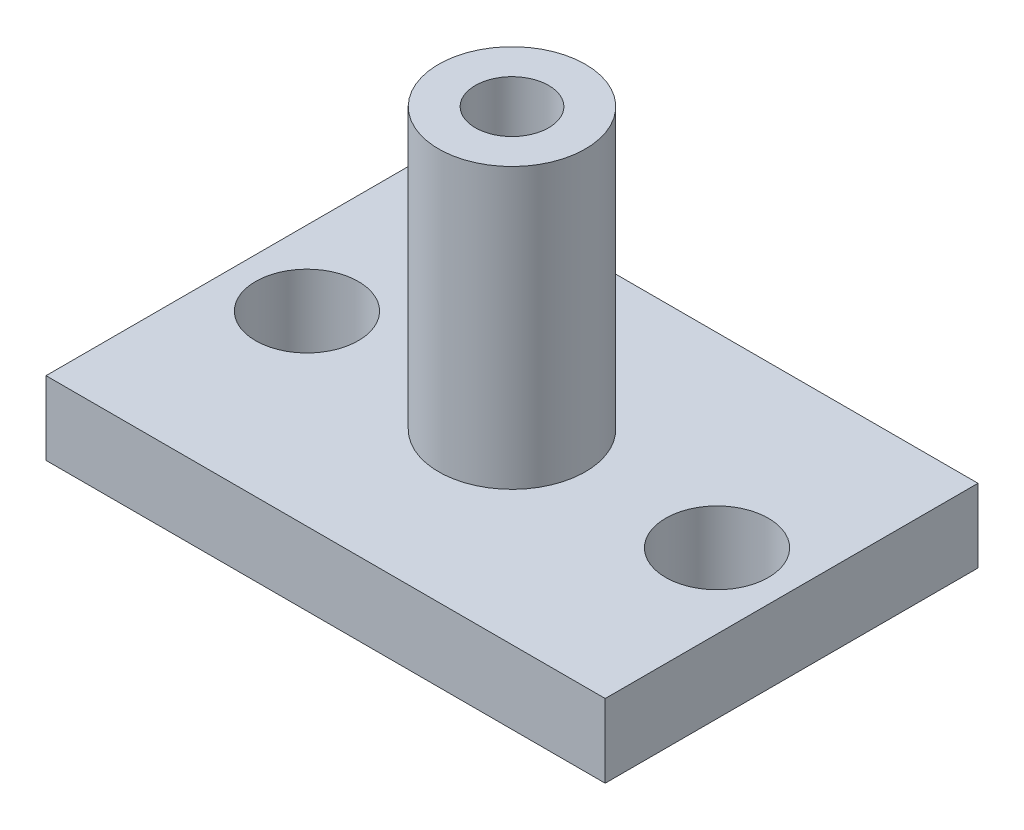
ISO-10303-21;
HEADER;
FILE_DESCRIPTION(('STEP AP214'),'2;1');
FILE_NAME('part.step','',(''),(''),'','','');
FILE_SCHEMA(('AUTOMOTIVE_DESIGN { 1 0 10303 214 1 1 1 1 }'));
ENDSEC;
DATA;
#1=APPLICATION_CONTEXT('core data for automotive mechanical design processes');
#2=APPLICATION_PROTOCOL_DEFINITION('international standard','automotive_design',2000,#1);
#3=PRODUCT_CONTEXT('',#1,'mechanical');
#4=PRODUCT('Part','Part','',(#3));
#5=PRODUCT_RELATED_PRODUCT_CATEGORY('part','',(#4));
#6=PRODUCT_DEFINITION_FORMATION('','',#4);
#7=PRODUCT_DEFINITION_CONTEXT('part definition',#1,'design');
#8=PRODUCT_DEFINITION('design','',#6,#7);
#9=PRODUCT_DEFINITION_SHAPE('','',#8);
#10=(LENGTH_UNIT() NAMED_UNIT(*) SI_UNIT(.MILLI.,.METRE.));
#11=(NAMED_UNIT(*) PLANE_ANGLE_UNIT() SI_UNIT($,.RADIAN.));
#12=(NAMED_UNIT(*) SI_UNIT($,.STERADIAN.) SOLID_ANGLE_UNIT());
#13=UNCERTAINTY_MEASURE_WITH_UNIT(LENGTH_MEASURE(1.E-05),#10,'distance_accuracy_value','');
#14=(GEOMETRIC_REPRESENTATION_CONTEXT(3) GLOBAL_UNCERTAINTY_ASSIGNED_CONTEXT((#13)) GLOBAL_UNIT_ASSIGNED_CONTEXT((#10,
#11,#12)) REPRESENTATION_CONTEXT('',''));
#15=CARTESIAN_POINT('',(0.,0.,0.));
#16=DIRECTION('',(0.,0.,1.));
#17=DIRECTION('',(1.,0.,0.));
#18=AXIS2_PLACEMENT_3D('',#15,#16,#17);
#19=CARTESIAN_POINT('',(0.,5.,0.));
#20=DIRECTION('',(0.,1.,0.));
#21=DIRECTION('',(0.,0.,1.));
#22=AXIS2_PLACEMENT_3D('',#19,#20,#21);
#23=PLANE('',#22);
#24=CARTESIAN_POINT('',(-20.7617391304348,5.,0.));
#25=DIRECTION('',(0.,1.,0.));
#26=DIRECTION('',(0.,0.,1.));
#27=AXIS2_PLACEMENT_3D('',#24,#25,#26);
#28=CIRCLE('',#27,3.5);
#29=CARTESIAN_POINT('',(-20.7617391304348,5.,3.5));
#30=VERTEX_POINT('',#29);
#31=EDGE_CURVE('E166',#30,#30,#28,.T.);
#32=ORIENTED_EDGE('',*,*,#31,.F.);
#33=EDGE_LOOP('',(#32));
#34=FACE_BOUND('',#33,.T.);
#35=CARTESIAN_POINT('',(7.17826086956524,5.,0.));
#36=DIRECTION('',(0.,1.,0.));
#37=DIRECTION('',(0.,0.,1.));
#38=AXIS2_PLACEMENT_3D('',#35,#36,#37);
#39=CIRCLE('',#38,3.5);
#40=CARTESIAN_POINT('',(7.17826086956524,5.,3.5));
#41=VERTEX_POINT('',#40);
#42=EDGE_CURVE('E168',#41,#41,#39,.T.);
#43=ORIENTED_EDGE('',*,*,#42,.F.);
#44=EDGE_LOOP('',(#43));
#45=FACE_BOUND('',#44,.T.);
#46=DIRECTION('',(0.,0.,1.));
#47=VECTOR('',#46,1.);
#48=CARTESIAN_POINT('',(-25.8417391304348,5.,-12.7));
#49=LINE('',#48,#47);
#50=CARTESIAN_POINT('',(-25.8417391304348,5.,-12.7));
#51=VERTEX_POINT('',#50);
#52=CARTESIAN_POINT('',(-25.8417391304348,5.,12.7));
#53=VERTEX_POINT('',#52);
#54=EDGE_CURVE('E86',#51,#53,#49,.T.);
#55=ORIENTED_EDGE('',*,*,#54,.T.);
#56=DIRECTION('',(1.,0.,0.));
#57=VECTOR('',#56,1.);
#58=CARTESIAN_POINT('',(-25.8417391304348,5.,12.7));
#59=LINE('',#58,#57);
#60=CARTESIAN_POINT('',(12.2582608695652,5.,12.7));
#61=VERTEX_POINT('',#60);
#62=EDGE_CURVE('E81',#53,#61,#59,.T.);
#63=ORIENTED_EDGE('',*,*,#62,.T.);
#64=DIRECTION('',(0.,0.,-1.));
#65=VECTOR('',#64,1.);
#66=CARTESIAN_POINT('',(12.2582608695652,5.,-12.7));
#67=LINE('',#66,#65);
#68=CARTESIAN_POINT('',(12.2582608695652,5.,-12.7));
#69=VERTEX_POINT('',#68);
#70=EDGE_CURVE('E84',#61,#69,#67,.T.);
#71=ORIENTED_EDGE('',*,*,#70,.T.);
#72=DIRECTION('',(-1.,0.,0.));
#73=VECTOR('',#72,1.);
#74=CARTESIAN_POINT('',(-25.8417391304348,5.,-12.7));
#75=LINE('',#74,#73);
#76=EDGE_CURVE('E50',#69,#51,#75,.T.);
#77=ORIENTED_EDGE('',*,*,#76,.T.);
#78=EDGE_LOOP('',(#55,#63,#71,#77));
#79=FACE_BOUND('',#78,.T.);
#80=CARTESIAN_POINT('',(-6.79173913043476,5.,0.));
#81=DIRECTION('',(0.,1.,0.));
#82=DIRECTION('',(0.,0.,1.));
#83=AXIS2_PLACEMENT_3D('',#80,#81,#82);
#84=CIRCLE('',#83,5.);
#85=CARTESIAN_POINT('',(-6.79173913043476,5.,-5.00000000000001));
#86=VERTEX_POINT('',#85);
#87=EDGE_CURVE('E178',#86,#86,#84,.T.);
#88=ORIENTED_EDGE('',*,*,#87,.F.);
#89=EDGE_LOOP('',(#88));
#90=FACE_BOUND('',#89,.T.);
#91=ADVANCED_FACE('F33',(#34,#45,#79,#90),#23,.T.);
#92=CARTESIAN_POINT('',(-25.8417391304348,5.,-12.7));
#93=DIRECTION('',(1.,0.,0.));
#94=DIRECTION('',(0.,0.,-1.));
#95=AXIS2_PLACEMENT_3D('',#92,#93,#94);
#96=PLANE('',#95);
#97=DIRECTION('',(0.,0.,1.));
#98=VECTOR('',#97,1.);
#99=CARTESIAN_POINT('',(-25.8417391304348,0.,-12.7));
#100=LINE('',#99,#98);
#101=CARTESIAN_POINT('',(-25.8417391304348,0.,-12.7));
#102=VERTEX_POINT('',#101);
#103=CARTESIAN_POINT('',(-25.8417391304348,0.,12.7));
#104=VERTEX_POINT('',#103);
#105=EDGE_CURVE('E100',#102,#104,#100,.T.);
#106=ORIENTED_EDGE('',*,*,#105,.T.);
#107=DIRECTION('',(0.,-1.,0.));
#108=VECTOR('',#107,1.);
#109=CARTESIAN_POINT('',(-25.8417391304348,5.,12.7));
#110=LINE('',#109,#108);
#111=EDGE_CURVE('E42',#53,#104,#110,.T.);
#112=ORIENTED_EDGE('',*,*,#111,.F.);
#113=ORIENTED_EDGE('',*,*,#54,.F.);
#114=DIRECTION('',(0.,-1.,0.));
#115=VECTOR('',#114,1.);
#116=CARTESIAN_POINT('',(-25.8417391304348,5.,-12.7));
#117=LINE('',#116,#115);
#118=EDGE_CURVE('E96',#51,#102,#117,.T.);
#119=ORIENTED_EDGE('',*,*,#118,.T.);
#120=EDGE_LOOP('',(#106,#112,#113,#119));
#121=FACE_BOUND('',#120,.T.);
#122=ADVANCED_FACE('F35',(#121),#96,.F.);
#123=CARTESIAN_POINT('',(-25.8417391304348,5.,12.7));
#124=DIRECTION('',(0.,0.,-1.));
#125=DIRECTION('',(-1.,0.,0.));
#126=AXIS2_PLACEMENT_3D('',#123,#124,#125);
#127=PLANE('',#126);
#128=DIRECTION('',(1.,0.,0.));
#129=VECTOR('',#128,1.);
#130=CARTESIAN_POINT('',(-25.8417391304348,0.,12.7));
#131=LINE('',#130,#129);
#132=CARTESIAN_POINT('',(12.2582608695652,0.,12.7));
#133=VERTEX_POINT('',#132);
#134=EDGE_CURVE('E91',#104,#133,#131,.T.);
#135=ORIENTED_EDGE('',*,*,#134,.T.);
#136=DIRECTION('',(0.,-1.,0.));
#137=VECTOR('',#136,1.);
#138=CARTESIAN_POINT('',(12.2582608695652,5.,12.7));
#139=LINE('',#138,#137);
#140=EDGE_CURVE('E89',#61,#133,#139,.T.);
#141=ORIENTED_EDGE('',*,*,#140,.F.);
#142=ORIENTED_EDGE('',*,*,#62,.F.);
#143=ORIENTED_EDGE('',*,*,#111,.T.);
#144=EDGE_LOOP('',(#135,#141,#142,#143));
#145=FACE_BOUND('',#144,.T.);
#146=ADVANCED_FACE('F90',(#145),#127,.F.);
#147=CARTESIAN_POINT('',(12.2582608695652,5.,-12.7));
#148=DIRECTION('',(-1.,0.,0.));
#149=DIRECTION('',(0.,0.,1.));
#150=AXIS2_PLACEMENT_3D('',#147,#148,#149);
#151=PLANE('',#150);
#152=DIRECTION('',(0.,0.,-1.));
#153=VECTOR('',#152,1.);
#154=CARTESIAN_POINT('',(12.2582608695652,0.,-12.7));
#155=LINE('',#154,#153);
#156=CARTESIAN_POINT('',(12.2582608695652,0.,-12.7));
#157=VERTEX_POINT('',#156);
#158=EDGE_CURVE('E67',#133,#157,#155,.T.);
#159=ORIENTED_EDGE('',*,*,#158,.T.);
#160=DIRECTION('',(0.,-1.,0.));
#161=VECTOR('',#160,1.);
#162=CARTESIAN_POINT('',(12.2582608695652,5.,-12.7));
#163=LINE('',#162,#161);
#164=EDGE_CURVE('E92',#69,#157,#163,.T.);
#165=ORIENTED_EDGE('',*,*,#164,.F.);
#166=ORIENTED_EDGE('',*,*,#70,.F.);
#167=ORIENTED_EDGE('',*,*,#140,.T.);
#168=EDGE_LOOP('',(#159,#165,#166,#167));
#169=FACE_BOUND('',#168,.T.);
#170=ADVANCED_FACE('F94',(#169),#151,.F.);
#171=CARTESIAN_POINT('',(-25.8417391304348,5.,-12.7));
#172=DIRECTION('',(0.,0.,1.));
#173=DIRECTION('',(1.,0.,0.));
#174=AXIS2_PLACEMENT_3D('',#171,#172,#173);
#175=PLANE('',#174);
#176=DIRECTION('',(-1.,0.,0.));
#177=VECTOR('',#176,1.);
#178=CARTESIAN_POINT('',(-25.8417391304348,0.,-12.7));
#179=LINE('',#178,#177);
#180=EDGE_CURVE('E73',#157,#102,#179,.T.);
#181=ORIENTED_EDGE('',*,*,#180,.T.);
#182=ORIENTED_EDGE('',*,*,#118,.F.);
#183=ORIENTED_EDGE('',*,*,#76,.F.);
#184=ORIENTED_EDGE('',*,*,#164,.T.);
#185=EDGE_LOOP('',(#181,#182,#183,#184));
#186=FACE_BOUND('',#185,.T.);
#187=ADVANCED_FACE('F114',(#186),#175,.F.);
#188=CARTESIAN_POINT('',(0.,0.,0.));
#189=DIRECTION('',(0.,1.,0.));
#190=DIRECTION('',(0.,0.,1.));
#191=AXIS2_PLACEMENT_3D('',#188,#189,#190);
#192=PLANE('',#191);
#193=CARTESIAN_POINT('',(-20.7617391304348,0.,0.));
#194=DIRECTION('',(0.,1.,0.));
#195=DIRECTION('',(0.,0.,1.));
#196=AXIS2_PLACEMENT_3D('',#193,#194,#195);
#197=CIRCLE('',#196,3.5);
#198=CARTESIAN_POINT('',(-20.7617391304348,0.,3.5));
#199=VERTEX_POINT('',#198);
#200=EDGE_CURVE('E164',#199,#199,#197,.T.);
#201=ORIENTED_EDGE('',*,*,#200,.T.);
#202=EDGE_LOOP('',(#201));
#203=FACE_BOUND('',#202,.T.);
#204=CARTESIAN_POINT('',(7.17826086956524,0.,0.));
#205=DIRECTION('',(0.,1.,0.));
#206=DIRECTION('',(0.,0.,1.));
#207=AXIS2_PLACEMENT_3D('',#204,#205,#206);
#208=CIRCLE('',#207,3.5);
#209=CARTESIAN_POINT('',(7.17826086956524,0.,3.5));
#210=VERTEX_POINT('',#209);
#211=EDGE_CURVE('E171',#210,#210,#208,.T.);
#212=ORIENTED_EDGE('',*,*,#211,.T.);
#213=EDGE_LOOP('',(#212));
#214=FACE_BOUND('',#213,.T.);
#215=ORIENTED_EDGE('',*,*,#105,.F.);
#216=ORIENTED_EDGE('',*,*,#180,.F.);
#217=ORIENTED_EDGE('',*,*,#158,.F.);
#218=ORIENTED_EDGE('',*,*,#134,.F.);
#219=EDGE_LOOP('',(#215,#216,#217,#218));
#220=FACE_BOUND('',#219,.T.);
#221=ADVANCED_FACE('F111',(#203,#214,#220),#192,.F.);
#222=CARTESIAN_POINT('',(-6.79173913043476,24.05,0.));
#223=DIRECTION('',(0.,1.,0.));
#224=DIRECTION('',(0.,0.,1.));
#225=AXIS2_PLACEMENT_3D('',#222,#223,#224);
#226=PLANE('',#225);
#227=CARTESIAN_POINT('',(-6.79173913043476,24.05,0.));
#228=DIRECTION('',(0.,1.,0.));
#229=DIRECTION('',(0.,0.,1.));
#230=AXIS2_PLACEMENT_3D('',#227,#228,#229);
#231=CIRCLE('',#230,5.);
#232=CARTESIAN_POINT('',(-6.79173913043476,24.05,-5.00000000000001));
#233=VERTEX_POINT('',#232);
#234=EDGE_CURVE('E103',#233,#233,#231,.T.);
#235=ORIENTED_EDGE('',*,*,#234,.T.);
#236=EDGE_LOOP('',(#235));
#237=FACE_BOUND('',#236,.T.);
#238=CARTESIAN_POINT('',(-6.79173913043476,24.05,0.));
#239=DIRECTION('',(0.,1.,0.));
#240=DIRECTION('',(0.,0.,1.));
#241=AXIS2_PLACEMENT_3D('',#238,#239,#240);
#242=CIRCLE('',#241,2.5);
#243=CARTESIAN_POINT('',(-6.79173913043476,24.05,-2.50000000000001));
#244=VERTEX_POINT('',#243);
#245=EDGE_CURVE('E174',#244,#244,#242,.T.);
#246=ORIENTED_EDGE('',*,*,#245,.F.);
#247=EDGE_LOOP('',(#246));
#248=FACE_BOUND('',#247,.T.);
#249=ADVANCED_FACE('F113',(#237,#248),#226,.T.);
#250=CARTESIAN_POINT('',(-6.79173913043476,24.05,0.));
#251=DIRECTION('',(0.,-1.,0.));
#252=DIRECTION('',(0.,0.,-1.));
#253=AXIS2_PLACEMENT_3D('',#250,#251,#252);
#254=CYLINDRICAL_SURFACE('',#253,5.);
#255=CARTESIAN_POINT('',(-6.79173913043476,24.05,-5.00000000000001));
#256=CARTESIAN_POINT('',(-6.79173913043476,23.8515625,-5.00000000000001));
#257=CARTESIAN_POINT('',(-6.79173913043476,23.653125,-5.00000000000001));
#258=CARTESIAN_POINT('',(-6.79173913043476,23.25625,-5.00000000000001));
#259=CARTESIAN_POINT('',(-6.79173913043476,23.0578125,-5.00000000000001));
#260=CARTESIAN_POINT('',(-6.79173913043476,22.6609375,-5.00000000000001));
#261=CARTESIAN_POINT('',(-6.79173913043476,22.4625,-5.00000000000001));
#262=CARTESIAN_POINT('',(-6.79173913043476,22.065625,-5.00000000000001));
#263=CARTESIAN_POINT('',(-6.79173913043476,21.8671875,-5.00000000000001));
#264=CARTESIAN_POINT('',(-6.79173913043476,21.4703125,-5.00000000000001));
#265=CARTESIAN_POINT('',(-6.79173913043476,21.271875,-5.00000000000001));
#266=CARTESIAN_POINT('',(-6.79173913043476,20.875,-5.00000000000001));
#267=CARTESIAN_POINT('',(-6.79173913043476,20.6765625,-5.00000000000001));
#268=CARTESIAN_POINT('',(-6.79173913043476,20.2796875,-5.00000000000001));
#269=CARTESIAN_POINT('',(-6.79173913043476,20.08125,-5.00000000000001));
#270=CARTESIAN_POINT('',(-6.79173913043476,19.684375,-5.00000000000001));
#271=CARTESIAN_POINT('',(-6.79173913043476,19.4859375,-5.00000000000001));
#272=CARTESIAN_POINT('',(-6.79173913043476,19.0890625,-5.00000000000001));
#273=CARTESIAN_POINT('',(-6.79173913043476,18.890625,-5.00000000000001));
#274=CARTESIAN_POINT('',(-6.79173913043476,18.49375,-5.00000000000001));
#275=CARTESIAN_POINT('',(-6.79173913043476,18.2953125,-5.00000000000001));
#276=CARTESIAN_POINT('',(-6.79173913043476,17.8984375,-5.00000000000001));
#277=CARTESIAN_POINT('',(-6.79173913043476,17.7,-5.00000000000001));
#278=CARTESIAN_POINT('',(-6.79173913043476,17.303125,-5.00000000000001));
#279=CARTESIAN_POINT('',(-6.79173913043476,17.1046875,-5.00000000000001));
#280=CARTESIAN_POINT('',(-6.79173913043476,16.7078125,-5.00000000000001));
#281=CARTESIAN_POINT('',(-6.79173913043476,16.509375,-5.00000000000001));
#282=CARTESIAN_POINT('',(-6.79173913043476,16.1125,-5.00000000000001));
#283=CARTESIAN_POINT('',(-6.79173913043476,15.9140625,-5.00000000000001));
#284=CARTESIAN_POINT('',(-6.79173913043476,15.5171875,-5.00000000000001));
#285=CARTESIAN_POINT('',(-6.79173913043476,15.31875,-5.00000000000001));
#286=CARTESIAN_POINT('',(-6.79173913043476,14.921875,-5.00000000000001));
#287=CARTESIAN_POINT('',(-6.79173913043476,14.7234375,-5.00000000000001));
#288=CARTESIAN_POINT('',(-6.79173913043476,14.3265625,-5.00000000000001));
#289=CARTESIAN_POINT('',(-6.79173913043476,14.128125,-5.00000000000001));
#290=CARTESIAN_POINT('',(-6.79173913043476,13.73125,-5.00000000000001));
#291=CARTESIAN_POINT('',(-6.79173913043476,13.5328125,-5.00000000000001));
#292=CARTESIAN_POINT('',(-6.79173913043476,13.1359375,-5.00000000000001));
#293=CARTESIAN_POINT('',(-6.79173913043476,12.9375,-5.00000000000001));
#294=CARTESIAN_POINT('',(-6.79173913043476,12.540625,-5.00000000000001));
#295=CARTESIAN_POINT('',(-6.79173913043476,12.3421875,-5.00000000000001));
#296=CARTESIAN_POINT('',(-6.79173913043476,11.9453125,-5.00000000000001));
#297=CARTESIAN_POINT('',(-6.79173913043476,11.746875,-5.00000000000001));
#298=CARTESIAN_POINT('',(-6.79173913043476,11.35,-5.00000000000001));
#299=CARTESIAN_POINT('',(-6.79173913043476,11.1515625,-5.00000000000001));
#300=CARTESIAN_POINT('',(-6.79173913043476,10.7546875,-5.00000000000001));
#301=CARTESIAN_POINT('',(-6.79173913043476,10.55625,-5.00000000000001));
#302=CARTESIAN_POINT('',(-6.79173913043476,10.159375,-5.00000000000001));
#303=CARTESIAN_POINT('',(-6.79173913043476,9.9609375,-5.00000000000001));
#304=CARTESIAN_POINT('',(-6.79173913043476,9.5640625,-5.00000000000001));
#305=CARTESIAN_POINT('',(-6.79173913043476,9.365625,-5.00000000000001));
#306=CARTESIAN_POINT('',(-6.79173913043476,8.96875,-5.00000000000001));
#307=CARTESIAN_POINT('',(-6.79173913043476,8.7703125,-5.00000000000001));
#308=CARTESIAN_POINT('',(-6.79173913043476,8.3734375,-5.00000000000001));
#309=CARTESIAN_POINT('',(-6.79173913043476,8.175,-5.00000000000001));
#310=CARTESIAN_POINT('',(-6.79173913043476,7.778125,-5.00000000000001));
#311=CARTESIAN_POINT('',(-6.79173913043476,7.5796875,-5.00000000000001));
#312=CARTESIAN_POINT('',(-6.79173913043476,7.1828125,-5.00000000000001));
#313=CARTESIAN_POINT('',(-6.79173913043476,6.984375,-5.00000000000001));
#314=CARTESIAN_POINT('',(-6.79173913043476,6.5875,-5.00000000000001));
#315=CARTESIAN_POINT('',(-6.79173913043476,6.3890625,-5.00000000000001));
#316=CARTESIAN_POINT('',(-6.79173913043476,5.9921875,-5.00000000000001));
#317=CARTESIAN_POINT('',(-6.79173913043476,5.79375,-5.00000000000001));
#318=CARTESIAN_POINT('',(-6.79173913043476,5.396875,-5.00000000000001));
#319=CARTESIAN_POINT('',(-6.79173913043476,5.1984375,-5.00000000000001));
#320=CARTESIAN_POINT('',(-6.79173913043476,5.,-5.00000000000001));
#321=B_SPLINE_CURVE_WITH_KNOTS('',3,(#255,#256,#257,#258,#259,#260,#261,#262,#263,#264,#265,
#266,#267,#268,#269,#270,#271,#272,#273,#274,#275,#276,#277,#278,#279,#280,#281,#282,#283,#284,
#285,#286,#287,#288,#289,#290,#291,#292,#293,#294,#295,#296,#297,#298,#299,#300,#301,#302,#303,
#304,#305,#306,#307,#308,#309,#310,#311,#312,#313,#314,#315,#316,#317,#318,#319,#320),
.UNSPECIFIED.,.F.,.F.,(4,2,2,2,2,2,2,2,2,2,2,2,2,2,2,2,2,2,2,2,2,2,2,2,2,2,2,2,2,2,2,2,4),(0.,
0.5953125,1.190625,1.7859375,2.38125,2.9765625,3.571875,4.1671875,4.7625,5.3578125,5.953125,
6.5484375,7.14375,7.7390625,8.334375,8.9296875,9.525,10.1203125,10.715625,11.3109375,11.90625,
12.5015625,13.096875,13.6921875,14.2875,14.8828125,15.478125,16.0734375,16.66875,17.2640625,
17.859375,18.4546875,19.05),.UNSPECIFIED.);
#322=EDGE_CURVE('BSEAM121',#233,#86,#321,.T.);
#323=ORIENTED_EDGE('',*,*,#234,.F.);
#324=ORIENTED_EDGE('',*,*,#87,.T.);
#325=ORIENTED_EDGE('',*,*,#322,.T.);
#326=ORIENTED_EDGE('',*,*,#322,.F.);
#327=EDGE_LOOP('',(#323,#325,#324,#326));
#328=FACE_BOUND('',#327,.T.);
#329=ADVANCED_FACE('F121',(#328),#254,.T.);
#330=CARTESIAN_POINT('',(-6.79173913043476,24.05,0.));
#331=DIRECTION('',(0.,-1.,0.));
#332=DIRECTION('',(0.,0.,-1.));
#333=AXIS2_PLACEMENT_3D('',#330,#331,#332);
#334=CYLINDRICAL_SURFACE('',#333,2.5);
#335=CARTESIAN_POINT('',(-6.79173913043476,5.,0.));
#336=DIRECTION('',(0.,1.,0.));
#337=DIRECTION('',(0.,0.,1.));
#338=AXIS2_PLACEMENT_3D('',#335,#336,#337);
#339=CIRCLE('',#338,2.5);
#340=CARTESIAN_POINT('',(-6.79173913043476,5.,-2.50000000000001));
#341=VERTEX_POINT('',#340);
#342=EDGE_CURVE('E11',#341,#341,#339,.F.);
#343=CARTESIAN_POINT('',(-6.79173913043476,24.05,-2.50000000000001));
#344=CARTESIAN_POINT('',(-6.79173913043476,23.8515625,-2.50000000000001));
#345=CARTESIAN_POINT('',(-6.79173913043476,23.653125,-2.50000000000001));
#346=CARTESIAN_POINT('',(-6.79173913043476,23.25625,-2.50000000000001));
#347=CARTESIAN_POINT('',(-6.79173913043476,23.0578125,-2.50000000000001));
#348=CARTESIAN_POINT('',(-6.79173913043476,22.6609375,-2.50000000000001));
#349=CARTESIAN_POINT('',(-6.79173913043476,22.4625,-2.50000000000001));
#350=CARTESIAN_POINT('',(-6.79173913043476,22.065625,-2.50000000000001));
#351=CARTESIAN_POINT('',(-6.79173913043476,21.8671875,-2.50000000000001));
#352=CARTESIAN_POINT('',(-6.79173913043476,21.4703125,-2.50000000000001));
#353=CARTESIAN_POINT('',(-6.79173913043476,21.271875,-2.50000000000001));
#354=CARTESIAN_POINT('',(-6.79173913043476,20.875,-2.50000000000001));
#355=CARTESIAN_POINT('',(-6.79173913043476,20.6765625,-2.50000000000001));
#356=CARTESIAN_POINT('',(-6.79173913043476,20.2796875,-2.50000000000001));
#357=CARTESIAN_POINT('',(-6.79173913043476,20.08125,-2.50000000000001));
#358=CARTESIAN_POINT('',(-6.79173913043476,19.684375,-2.50000000000001));
#359=CARTESIAN_POINT('',(-6.79173913043476,19.4859375,-2.50000000000001));
#360=CARTESIAN_POINT('',(-6.79173913043476,19.0890625,-2.50000000000001));
#361=CARTESIAN_POINT('',(-6.79173913043476,18.890625,-2.50000000000001));
#362=CARTESIAN_POINT('',(-6.79173913043476,18.49375,-2.50000000000001));
#363=CARTESIAN_POINT('',(-6.79173913043476,18.2953125,-2.50000000000001));
#364=CARTESIAN_POINT('',(-6.79173913043476,17.8984375,-2.50000000000001));
#365=CARTESIAN_POINT('',(-6.79173913043476,17.7,-2.50000000000001));
#366=CARTESIAN_POINT('',(-6.79173913043476,17.303125,-2.50000000000001));
#367=CARTESIAN_POINT('',(-6.79173913043476,17.1046875,-2.50000000000001));
#368=CARTESIAN_POINT('',(-6.79173913043476,16.7078125,-2.50000000000001));
#369=CARTESIAN_POINT('',(-6.79173913043476,16.509375,-2.50000000000001));
#370=CARTESIAN_POINT('',(-6.79173913043476,16.1125,-2.50000000000001));
#371=CARTESIAN_POINT('',(-6.79173913043476,15.9140625,-2.50000000000001));
#372=CARTESIAN_POINT('',(-6.79173913043476,15.5171875,-2.50000000000001));
#373=CARTESIAN_POINT('',(-6.79173913043476,15.31875,-2.50000000000001));
#374=CARTESIAN_POINT('',(-6.79173913043476,14.921875,-2.50000000000001));
#375=CARTESIAN_POINT('',(-6.79173913043476,14.7234375,-2.50000000000001));
#376=CARTESIAN_POINT('',(-6.79173913043476,14.3265625,-2.50000000000001));
#377=CARTESIAN_POINT('',(-6.79173913043476,14.128125,-2.50000000000001));
#378=CARTESIAN_POINT('',(-6.79173913043476,13.73125,-2.50000000000001));
#379=CARTESIAN_POINT('',(-6.79173913043476,13.5328125,-2.50000000000001));
#380=CARTESIAN_POINT('',(-6.79173913043476,13.1359375,-2.50000000000001));
#381=CARTESIAN_POINT('',(-6.79173913043476,12.9375,-2.50000000000001));
#382=CARTESIAN_POINT('',(-6.79173913043476,12.540625,-2.50000000000001));
#383=CARTESIAN_POINT('',(-6.79173913043476,12.3421875,-2.50000000000001));
#384=CARTESIAN_POINT('',(-6.79173913043476,11.9453125,-2.50000000000001));
#385=CARTESIAN_POINT('',(-6.79173913043476,11.746875,-2.50000000000001));
#386=CARTESIAN_POINT('',(-6.79173913043476,11.35,-2.50000000000001));
#387=CARTESIAN_POINT('',(-6.79173913043476,11.1515625,-2.50000000000001));
#388=CARTESIAN_POINT('',(-6.79173913043476,10.7546875,-2.50000000000001));
#389=CARTESIAN_POINT('',(-6.79173913043476,10.55625,-2.50000000000001));
#390=CARTESIAN_POINT('',(-6.79173913043476,10.159375,-2.50000000000001));
#391=CARTESIAN_POINT('',(-6.79173913043476,9.9609375,-2.50000000000001));
#392=CARTESIAN_POINT('',(-6.79173913043476,9.5640625,-2.50000000000001));
#393=CARTESIAN_POINT('',(-6.79173913043476,9.365625,-2.50000000000001));
#394=CARTESIAN_POINT('',(-6.79173913043476,8.96875,-2.50000000000001));
#395=CARTESIAN_POINT('',(-6.79173913043476,8.7703125,-2.50000000000001));
#396=CARTESIAN_POINT('',(-6.79173913043476,8.3734375,-2.50000000000001));
#397=CARTESIAN_POINT('',(-6.79173913043476,8.175,-2.50000000000001));
#398=CARTESIAN_POINT('',(-6.79173913043476,7.778125,-2.50000000000001));
#399=CARTESIAN_POINT('',(-6.79173913043476,7.5796875,-2.50000000000001));
#400=CARTESIAN_POINT('',(-6.79173913043476,7.1828125,-2.50000000000001));
#401=CARTESIAN_POINT('',(-6.79173913043476,6.984375,-2.50000000000001));
#402=CARTESIAN_POINT('',(-6.79173913043476,6.5875,-2.50000000000001));
#403=CARTESIAN_POINT('',(-6.79173913043476,6.3890625,-2.50000000000001));
#404=CARTESIAN_POINT('',(-6.79173913043476,5.9921875,-2.50000000000001));
#405=CARTESIAN_POINT('',(-6.79173913043476,5.79375,-2.50000000000001));
#406=CARTESIAN_POINT('',(-6.79173913043476,5.396875,-2.50000000000001));
#407=CARTESIAN_POINT('',(-6.79173913043476,5.1984375,-2.50000000000001));
#408=CARTESIAN_POINT('',(-6.79173913043476,5.,-2.50000000000001));
#409=B_SPLINE_CURVE_WITH_KNOTS('',3,(#343,#344,#345,#346,#347,#348,#349,#350,#351,#352,#353,
#354,#355,#356,#357,#358,#359,#360,#361,#362,#363,#364,#365,#366,#367,#368,#369,#370,#371,#372,
#373,#374,#375,#376,#377,#378,#379,#380,#381,#382,#383,#384,#385,#386,#387,#388,#389,#390,#391,
#392,#393,#394,#395,#396,#397,#398,#399,#400,#401,#402,#403,#404,#405,#406,#407,#408),
.UNSPECIFIED.,.F.,.F.,(4,2,2,2,2,2,2,2,2,2,2,2,2,2,2,2,2,2,2,2,2,2,2,2,2,2,2,2,2,2,2,2,4),(0.,
0.5953125,1.190625,1.7859375,2.38125,2.9765625,3.571875,4.1671875,4.7625,5.3578125,5.953125,
6.5484375,7.14375,7.7390625,8.334375,8.9296875,9.525,10.1203125,10.715625,11.3109375,11.90625,
12.5015625,13.096875,13.6921875,14.2875,14.8828125,15.478125,16.0734375,16.66875,17.2640625,
17.859375,18.4546875,19.05),.UNSPECIFIED.);
#410=EDGE_CURVE('BSEAM139',#244,#341,#409,.T.);
#411=ORIENTED_EDGE('',*,*,#245,.T.);
#412=ORIENTED_EDGE('',*,*,#342,.T.);
#413=ORIENTED_EDGE('',*,*,#410,.T.);
#414=ORIENTED_EDGE('',*,*,#410,.F.);
#415=EDGE_LOOP('',(#411,#413,#412,#414));
#416=FACE_BOUND('',#415,.T.);
#417=ADVANCED_FACE('F139',(#416),#334,.F.);
#418=ORIENTED_EDGE('',*,*,#342,.F.);
#419=EDGE_LOOP('',(#418));
#420=FACE_BOUND('',#419,.T.);
#421=ADVANCED_FACE('F130',(#420),#23,.T.);
#422=CARTESIAN_POINT('',(7.17826086956524,0.,0.));
#423=DIRECTION('',(0.,1.,0.));
#424=DIRECTION('',(0.,0.,1.));
#425=AXIS2_PLACEMENT_3D('',#422,#423,#424);
#426=CYLINDRICAL_SURFACE('',#425,3.5);
#427=ORIENTED_EDGE('',*,*,#211,.F.);
#428=EDGE_LOOP('',(#427));
#429=FACE_BOUND('',#428,.T.);
#430=ORIENTED_EDGE('',*,*,#42,.T.);
#431=EDGE_LOOP('',(#430));
#432=FACE_BOUND('',#431,.T.);
#433=ADVANCED_FACE('F138',(#429,#432),#426,.F.);
#434=CARTESIAN_POINT('',(-20.7617391304348,0.,0.));
#435=DIRECTION('',(0.,1.,0.));
#436=DIRECTION('',(0.,0.,1.));
#437=AXIS2_PLACEMENT_3D('',#434,#435,#436);
#438=CYLINDRICAL_SURFACE('',#437,3.5);
#439=ORIENTED_EDGE('',*,*,#200,.F.);
#440=EDGE_LOOP('',(#439));
#441=FACE_BOUND('',#440,.T.);
#442=ORIENTED_EDGE('',*,*,#31,.T.);
#443=EDGE_LOOP('',(#442));
#444=FACE_BOUND('',#443,.T.);
#445=ADVANCED_FACE('F145',(#441,#444),#438,.F.);
#446=CLOSED_SHELL('',(#91,#122,#146,#170,#187,#221,#249,#329,#417,#421,#433,#445));
#447=MANIFOLD_SOLID_BREP('B2',#446);
#448=ADVANCED_BREP_SHAPE_REPRESENTATION('',(#18,#447),#14);
#449=SHAPE_DEFINITION_REPRESENTATION(#9,#448);
ENDSEC;
END-ISO-10303-21;
